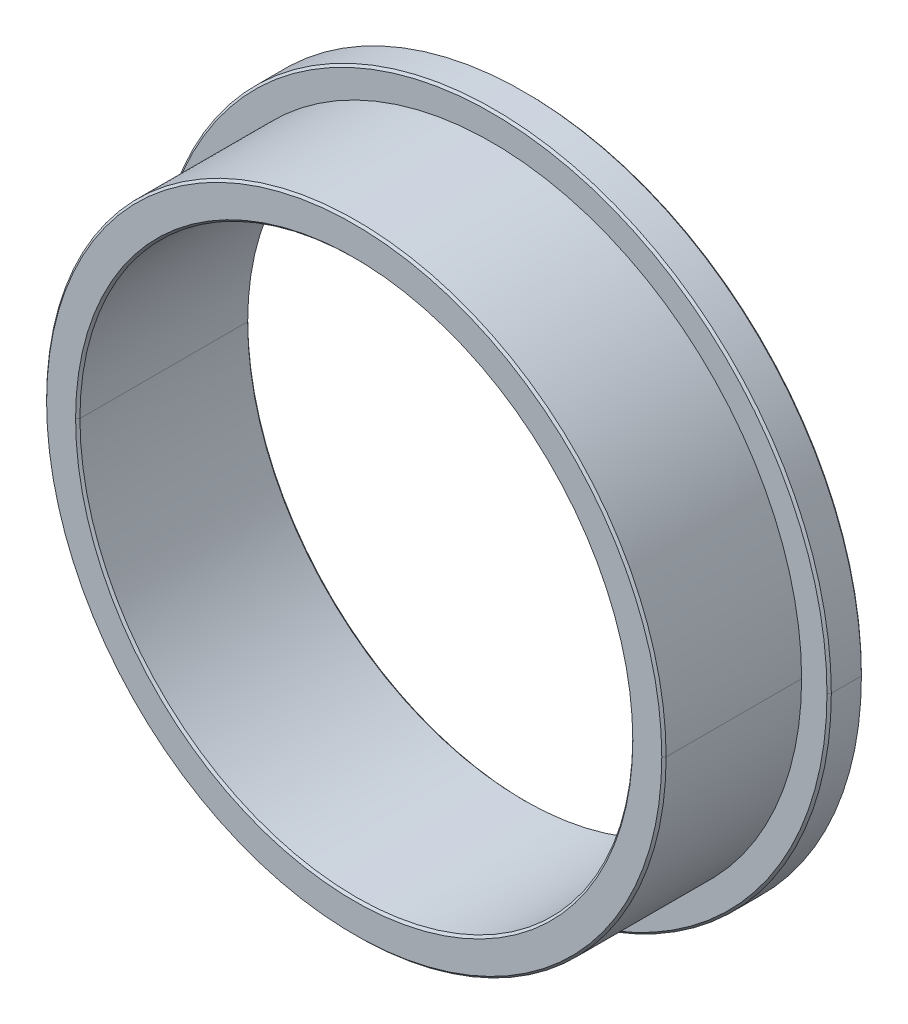
ISO-10303-21;
HEADER;
FILE_DESCRIPTION(('STEP AP214'),'2;1');
FILE_NAME('part.step','',(''),(''),'','','');
FILE_SCHEMA(('AUTOMOTIVE_DESIGN { 1 0 10303 214 1 1 1 1 }'));
ENDSEC;
DATA;
#1=APPLICATION_CONTEXT('core data for automotive mechanical design processes');
#2=APPLICATION_PROTOCOL_DEFINITION('international standard','automotive_design',2000,#1);
#3=PRODUCT_CONTEXT('',#1,'mechanical');
#4=PRODUCT('Part','Part','',(#3));
#5=PRODUCT_RELATED_PRODUCT_CATEGORY('part','',(#4));
#6=PRODUCT_DEFINITION_FORMATION('','',#4);
#7=PRODUCT_DEFINITION_CONTEXT('part definition',#1,'design');
#8=PRODUCT_DEFINITION('design','',#6,#7);
#9=PRODUCT_DEFINITION_SHAPE('','',#8);
#10=(LENGTH_UNIT() NAMED_UNIT(*) SI_UNIT(.MILLI.,.METRE.));
#11=(NAMED_UNIT(*) PLANE_ANGLE_UNIT() SI_UNIT($,.RADIAN.));
#12=(NAMED_UNIT(*) SI_UNIT($,.STERADIAN.) SOLID_ANGLE_UNIT());
#13=UNCERTAINTY_MEASURE_WITH_UNIT(LENGTH_MEASURE(1.E-05),#10,'distance_accuracy_value','');
#14=(GEOMETRIC_REPRESENTATION_CONTEXT(3) GLOBAL_UNCERTAINTY_ASSIGNED_CONTEXT((#13)) GLOBAL_UNIT_ASSIGNED_CONTEXT((#10,
#11,#12)) REPRESENTATION_CONTEXT('',''));
#15=CARTESIAN_POINT('',(0.,0.,0.));
#16=DIRECTION('',(0.,0.,1.));
#17=DIRECTION('',(1.,0.,0.));
#18=AXIS2_PLACEMENT_3D('',#15,#16,#17);
#19=CARTESIAN_POINT('',(0.,0.,6.35));
#20=DIRECTION('',(0.,0.,-1.));
#21=DIRECTION('',(-1.,0.,0.));
#22=AXIS2_PLACEMENT_3D('',#19,#20,#21);
#23=CONICAL_SURFACE('',#22,14.1875,0.785398163397448);
#24=DIRECTION('',(0.707106781186548,0.,-0.707106781186548));
#25=VECTOR('',#24,1.);
#26=CARTESIAN_POINT('',(14.1875,0.,6.35));
#27=LINE('',#26,#25);
#28=CARTESIAN_POINT('',(14.1875,0.,6.35));
#29=VERTEX_POINT('',#28);
#30=CARTESIAN_POINT('',(14.2875,0.,6.25));
#31=VERTEX_POINT('',#30);
#32=EDGE_CURVE('E241',#29,#31,#27,.T.);
#33=ORIENTED_EDGE('',*,*,#32,.F.);
#34=CARTESIAN_POINT('',(0.,0.,6.35));
#35=DIRECTION('',(0.,0.,1.));
#36=DIRECTION('',(1.,0.,0.));
#37=AXIS2_PLACEMENT_3D('',#34,#35,#36);
#38=CIRCLE('',#37,14.1875);
#39=CARTESIAN_POINT('',(-14.1875,0.,6.35));
#40=VERTEX_POINT('',#39);
#41=EDGE_CURVE('E175',#40,#29,#38,.T.);
#42=ORIENTED_EDGE('',*,*,#41,.F.);
#43=DIRECTION('',(-0.707106781186548,0.,-0.707106781186548));
#44=VECTOR('',#43,1.);
#45=CARTESIAN_POINT('',(-14.1875,0.,6.35));
#46=LINE('',#45,#44);
#47=CARTESIAN_POINT('',(-14.2875,0.,6.25));
#48=VERTEX_POINT('',#47);
#49=EDGE_CURVE('E188',#40,#48,#46,.T.);
#50=ORIENTED_EDGE('',*,*,#49,.T.);
#51=CARTESIAN_POINT('',(0.,0.,6.25));
#52=DIRECTION('',(0.,0.,-1.));
#53=DIRECTION('',(1.,0.,0.));
#54=AXIS2_PLACEMENT_3D('',#51,#52,#53);
#55=CIRCLE('',#54,14.2875);
#56=EDGE_CURVE('E9',#31,#48,#55,.T.);
#57=ORIENTED_EDGE('',*,*,#56,.F.);
#58=EDGE_LOOP('',(#33,#42,#50,#57));
#59=FACE_BOUND('',#58,.T.);
#60=ADVANCED_FACE('F14',(#59),#23,.T.);
#61=CARTESIAN_POINT('',(0.,0.,6.25));
#62=DIRECTION('',(0.,0.,1.));
#63=DIRECTION('',(1.,0.,0.));
#64=AXIS2_PLACEMENT_3D('',#61,#62,#63);
#65=CONICAL_SURFACE('',#64,12.7508,0.785398163397466);
#66=DIRECTION('',(-0.70710678118656,0.,0.707106781186535));
#67=VECTOR('',#66,1.);
#68=CARTESIAN_POINT('',(-12.7508,0.,6.25));
#69=LINE('',#68,#67);
#70=CARTESIAN_POINT('',(-12.7508,0.,6.25));
#71=VERTEX_POINT('',#70);
#72=CARTESIAN_POINT('',(-12.8508,0.,6.35));
#73=VERTEX_POINT('',#72);
#74=EDGE_CURVE('E215',#71,#73,#69,.T.);
#75=ORIENTED_EDGE('',*,*,#74,.F.);
#76=CARTESIAN_POINT('',(0.,0.,6.25));
#77=DIRECTION('',(0.,0.,1.));
#78=DIRECTION('',(1.,0.,0.));
#79=AXIS2_PLACEMENT_3D('',#76,#77,#78);
#80=CIRCLE('',#79,12.7508);
#81=CARTESIAN_POINT('',(12.7508,0.,6.25));
#82=VERTEX_POINT('',#81);
#83=EDGE_CURVE('E211',#82,#71,#80,.T.);
#84=ORIENTED_EDGE('',*,*,#83,.F.);
#85=DIRECTION('',(0.70710678118656,0.,0.707106781186535));
#86=VECTOR('',#85,1.);
#87=CARTESIAN_POINT('',(12.7508,0.,6.25));
#88=LINE('',#87,#86);
#89=CARTESIAN_POINT('',(12.8508,0.,6.35));
#90=VERTEX_POINT('',#89);
#91=EDGE_CURVE('E182',#82,#90,#88,.T.);
#92=ORIENTED_EDGE('',*,*,#91,.T.);
#93=CARTESIAN_POINT('',(0.,0.,6.35));
#94=DIRECTION('',(0.,0.,-1.));
#95=DIRECTION('',(1.,0.,0.));
#96=AXIS2_PLACEMENT_3D('',#93,#94,#95);
#97=CIRCLE('',#96,12.8508);
#98=EDGE_CURVE('E25',#73,#90,#97,.T.);
#99=ORIENTED_EDGE('',*,*,#98,.F.);
#100=EDGE_LOOP('',(#75,#84,#92,#99));
#101=FACE_BOUND('',#100,.T.);
#102=ADVANCED_FACE('F303',(#101),#65,.F.);
#103=CARTESIAN_POINT('',(0.,0.,0.));
#104=DIRECTION('',(0.,0.,-1.));
#105=DIRECTION('',(-1.,0.,0.));
#106=AXIS2_PLACEMENT_3D('',#103,#104,#105);
#107=CONICAL_SURFACE('',#106,15.4575,0.785398163397422);
#108=DIRECTION('',(0.707106781186529,0.,-0.707106781186566));
#109=VECTOR('',#108,1.);
#110=CARTESIAN_POINT('',(15.4575,0.,0.));
#111=LINE('',#110,#109);
#112=CARTESIAN_POINT('',(15.4575,0.,0.));
#113=VERTEX_POINT('',#112);
#114=CARTESIAN_POINT('',(15.5575,0.,-0.0999999999999925));
#115=VERTEX_POINT('',#114);
#116=EDGE_CURVE('E198',#113,#115,#111,.T.);
#117=ORIENTED_EDGE('',*,*,#116,.F.);
#118=CARTESIAN_POINT('',(0.,0.,0.));
#119=DIRECTION('',(0.,0.,1.));
#120=DIRECTION('',(1.,0.,0.));
#121=AXIS2_PLACEMENT_3D('',#118,#119,#120);
#122=CIRCLE('',#121,15.4575);
#123=CARTESIAN_POINT('',(-15.4575,0.,0.));
#124=VERTEX_POINT('',#123);
#125=EDGE_CURVE('E86',#124,#113,#122,.T.);
#126=ORIENTED_EDGE('',*,*,#125,.F.);
#127=DIRECTION('',(-0.707106781186529,0.,-0.707106781186566));
#128=VECTOR('',#127,1.);
#129=CARTESIAN_POINT('',(-15.4575,0.,0.));
#130=LINE('',#129,#128);
#131=CARTESIAN_POINT('',(-15.5575,0.,-0.0999999999999925));
#132=VERTEX_POINT('',#131);
#133=EDGE_CURVE('E167',#124,#132,#130,.T.);
#134=ORIENTED_EDGE('',*,*,#133,.T.);
#135=CARTESIAN_POINT('',(0.,0.,-0.0999999999999925));
#136=DIRECTION('',(0.,0.,-1.));
#137=DIRECTION('',(1.,0.,0.));
#138=AXIS2_PLACEMENT_3D('',#135,#136,#137);
#139=CIRCLE('',#138,15.5575);
#140=EDGE_CURVE('E140',#115,#132,#139,.T.);
#141=ORIENTED_EDGE('',*,*,#140,.F.);
#142=EDGE_LOOP('',(#117,#126,#134,#141));
#143=FACE_BOUND('',#142,.T.);
#144=ADVANCED_FACE('F399',(#143),#107,.T.);
#145=CARTESIAN_POINT('',(0.,0.,-1.5875));
#146=DIRECTION('',(0.,0.,-1.));
#147=DIRECTION('',(-1.,0.,0.));
#148=AXIS2_PLACEMENT_3D('',#145,#146,#147);
#149=CONICAL_SURFACE('',#148,12.8508,0.785398163397457);
#150=DIRECTION('',(0.707106781186554,0.,-0.707106781186542));
#151=VECTOR('',#150,1.);
#152=CARTESIAN_POINT('',(12.8508,0.,-1.5875));
#153=LINE('',#152,#151);
#154=CARTESIAN_POINT('',(12.7508,0.,-1.4875));
#155=VERTEX_POINT('',#154);
#156=CARTESIAN_POINT('',(12.8508,0.,-1.5875));
#157=VERTEX_POINT('',#156);
#158=EDGE_CURVE('E207',#155,#157,#153,.T.);
#159=ORIENTED_EDGE('',*,*,#158,.F.);
#160=CARTESIAN_POINT('',(0.,0.,-1.4875));
#161=DIRECTION('',(0.,0.,-1.));
#162=DIRECTION('',(1.,0.,0.));
#163=AXIS2_PLACEMENT_3D('',#160,#161,#162);
#164=CIRCLE('',#163,12.7508);
#165=CARTESIAN_POINT('',(-12.7508,0.,-1.4875));
#166=VERTEX_POINT('',#165);
#167=EDGE_CURVE('E208',#166,#155,#164,.T.);
#168=ORIENTED_EDGE('',*,*,#167,.F.);
#169=DIRECTION('',(-0.707106781186554,0.,-0.707106781186542));
#170=VECTOR('',#169,1.);
#171=CARTESIAN_POINT('',(-12.8508,0.,-1.5875));
#172=LINE('',#171,#170);
#173=CARTESIAN_POINT('',(-12.8508,0.,-1.5875));
#174=VERTEX_POINT('',#173);
#175=EDGE_CURVE('E156',#166,#174,#172,.T.);
#176=ORIENTED_EDGE('',*,*,#175,.T.);
#177=CARTESIAN_POINT('',(0.,0.,-1.5875));
#178=DIRECTION('',(0.,0.,1.));
#179=DIRECTION('',(1.,0.,0.));
#180=AXIS2_PLACEMENT_3D('',#177,#178,#179);
#181=CIRCLE('',#180,12.8508);
#182=EDGE_CURVE('E139',#157,#174,#181,.T.);
#183=ORIENTED_EDGE('',*,*,#182,.F.);
#184=EDGE_LOOP('',(#159,#168,#176,#183));
#185=FACE_BOUND('',#184,.T.);
#186=ADVANCED_FACE('F286',(#185),#149,.F.);
#187=CARTESIAN_POINT('',(0.,0.,-1.4875));
#188=DIRECTION('',(0.,0.,1.));
#189=DIRECTION('',(1.,0.,0.));
#190=AXIS2_PLACEMENT_3D('',#187,#188,#189);
#191=CONICAL_SURFACE('',#190,15.5575,0.785398163397457);
#192=DIRECTION('',(-0.707106781186554,0.,0.707106781186542));
#193=VECTOR('',#192,1.);
#194=CARTESIAN_POINT('',(-15.5575,0.,-1.4875));
#195=LINE('',#194,#193);
#196=CARTESIAN_POINT('',(-15.4575,0.,-1.5875));
#197=VERTEX_POINT('',#196);
#198=CARTESIAN_POINT('',(-15.5575,0.,-1.4875));
#199=VERTEX_POINT('',#198);
#200=EDGE_CURVE('E143',#197,#199,#195,.T.);
#201=ORIENTED_EDGE('',*,*,#200,.F.);
#202=CARTESIAN_POINT('',(0.,0.,-1.5875));
#203=DIRECTION('',(0.,0.,-1.));
#204=DIRECTION('',(1.,0.,0.));
#205=AXIS2_PLACEMENT_3D('',#202,#203,#204);
#206=CIRCLE('',#205,15.4575);
#207=CARTESIAN_POINT('',(15.4575,0.,-1.5875));
#208=VERTEX_POINT('',#207);
#209=EDGE_CURVE('E130',#208,#197,#206,.T.);
#210=ORIENTED_EDGE('',*,*,#209,.F.);
#211=DIRECTION('',(0.707106781186554,0.,0.707106781186542));
#212=VECTOR('',#211,1.);
#213=CARTESIAN_POINT('',(15.5575,0.,-1.4875));
#214=LINE('',#213,#212);
#215=CARTESIAN_POINT('',(15.5575,0.,-1.4875));
#216=VERTEX_POINT('',#215);
#217=EDGE_CURVE('E154',#208,#216,#214,.T.);
#218=ORIENTED_EDGE('',*,*,#217,.T.);
#219=CARTESIAN_POINT('',(0.,0.,-1.4875));
#220=DIRECTION('',(0.,0.,1.));
#221=DIRECTION('',(1.,0.,0.));
#222=AXIS2_PLACEMENT_3D('',#219,#220,#221);
#223=CIRCLE('',#222,15.5575);
#224=EDGE_CURVE('E146',#199,#216,#223,.T.);
#225=ORIENTED_EDGE('',*,*,#224,.F.);
#226=EDGE_LOOP('',(#201,#210,#218,#225));
#227=FACE_BOUND('',#226,.T.);
#228=ADVANCED_FACE('F144',(#227),#191,.T.);
#229=CARTESIAN_POINT('',(0.,0.,6.35));
#230=DIRECTION('',(0.,0.,-1.));
#231=DIRECTION('',(-1.,0.,0.));
#232=AXIS2_PLACEMENT_3D('',#229,#230,#231);
#233=CYLINDRICAL_SURFACE('',#232,14.2875);
#234=DIRECTION('',(0.,0.,-1.));
#235=VECTOR('',#234,1.);
#236=CARTESIAN_POINT('',(14.2875,0.,6.35));
#237=LINE('',#236,#235);
#238=CARTESIAN_POINT('',(14.2875,0.,0.));
#239=VERTEX_POINT('',#238);
#240=EDGE_CURVE('E227',#31,#239,#237,.T.);
#241=ORIENTED_EDGE('',*,*,#240,.F.);
#242=ORIENTED_EDGE('',*,*,#56,.T.);
#243=DIRECTION('',(0.,0.,-1.));
#244=VECTOR('',#243,1.);
#245=CARTESIAN_POINT('',(-14.2875,0.,6.35));
#246=LINE('',#245,#244);
#247=CARTESIAN_POINT('',(-14.2875,0.,0.));
#248=VERTEX_POINT('',#247);
#249=EDGE_CURVE('E181',#48,#248,#246,.T.);
#250=ORIENTED_EDGE('',*,*,#249,.T.);
#251=CARTESIAN_POINT('',(0.,0.,0.));
#252=DIRECTION('',(0.,0.,1.));
#253=DIRECTION('',(1.,0.,0.));
#254=AXIS2_PLACEMENT_3D('',#251,#252,#253);
#255=CIRCLE('',#254,14.2875);
#256=EDGE_CURVE('E39',#248,#239,#255,.T.);
#257=ORIENTED_EDGE('',*,*,#256,.T.);
#258=EDGE_LOOP('',(#241,#242,#250,#257));
#259=FACE_BOUND('',#258,.T.);
#260=ADVANCED_FACE('F308',(#259),#233,.T.);
#261=CARTESIAN_POINT('',(0.,0.,6.35));
#262=DIRECTION('',(0.,0.,1.));
#263=DIRECTION('',(1.,0.,0.));
#264=AXIS2_PLACEMENT_3D('',#261,#262,#263);
#265=PLANE('',#264);
#266=CARTESIAN_POINT('',(0.,0.,6.35));
#267=DIRECTION('',(0.,0.,-1.));
#268=DIRECTION('',(1.,0.,0.));
#269=AXIS2_PLACEMENT_3D('',#266,#267,#268);
#270=CIRCLE('',#269,12.8508);
#271=EDGE_CURVE('E187',#90,#73,#270,.T.);
#272=ORIENTED_EDGE('',*,*,#271,.T.);
#273=ORIENTED_EDGE('',*,*,#98,.T.);
#274=EDGE_LOOP('',(#272,#273));
#275=FACE_BOUND('',#274,.T.);
#276=ORIENTED_EDGE('',*,*,#41,.T.);
#277=CARTESIAN_POINT('',(0.,0.,6.35));
#278=DIRECTION('',(0.,0.,1.));
#279=DIRECTION('',(1.,0.,0.));
#280=AXIS2_PLACEMENT_3D('',#277,#278,#279);
#281=CIRCLE('',#280,14.1875);
#282=EDGE_CURVE('E237',#29,#40,#281,.T.);
#283=ORIENTED_EDGE('',*,*,#282,.T.);
#284=EDGE_LOOP('',(#276,#283));
#285=FACE_BOUND('',#284,.T.);
#286=ADVANCED_FACE('F305',(#275,#285),#265,.T.);
#287=CARTESIAN_POINT('',(0.,0.,-1.5875));
#288=DIRECTION('',(0.,0.,1.));
#289=DIRECTION('',(1.,0.,0.));
#290=AXIS2_PLACEMENT_3D('',#287,#288,#289);
#291=CYLINDRICAL_SURFACE('',#290,12.7508);
#292=DIRECTION('',(0.,0.,1.));
#293=VECTOR('',#292,1.);
#294=CARTESIAN_POINT('',(-12.7508,0.,-1.5875));
#295=LINE('',#294,#293);
#296=EDGE_CURVE('E176',#166,#71,#295,.T.);
#297=ORIENTED_EDGE('',*,*,#296,.F.);
#298=ORIENTED_EDGE('',*,*,#167,.T.);
#299=DIRECTION('',(0.,0.,1.));
#300=VECTOR('',#299,1.);
#301=CARTESIAN_POINT('',(12.7508,0.,-1.5875));
#302=LINE('',#301,#300);
#303=EDGE_CURVE('E180',#155,#82,#302,.T.);
#304=ORIENTED_EDGE('',*,*,#303,.T.);
#305=ORIENTED_EDGE('',*,*,#83,.T.);
#306=EDGE_LOOP('',(#297,#298,#304,#305));
#307=FACE_BOUND('',#306,.T.);
#308=ADVANCED_FACE('F298',(#307),#291,.F.);
#309=CARTESIAN_POINT('',(0.,0.,-1.5875));
#310=DIRECTION('',(0.,0.,1.));
#311=DIRECTION('',(1.,0.,0.));
#312=AXIS2_PLACEMENT_3D('',#309,#310,#311);
#313=PLANE('',#312);
#314=CARTESIAN_POINT('',(0.,0.,-1.5875));
#315=DIRECTION('',(0.,0.,1.));
#316=DIRECTION('',(1.,0.,0.));
#317=AXIS2_PLACEMENT_3D('',#314,#315,#316);
#318=CIRCLE('',#317,12.8508);
#319=EDGE_CURVE('E163',#174,#157,#318,.T.);
#320=ORIENTED_EDGE('',*,*,#319,.T.);
#321=ORIENTED_EDGE('',*,*,#182,.T.);
#322=EDGE_LOOP('',(#320,#321));
#323=FACE_BOUND('',#322,.T.);
#324=ORIENTED_EDGE('',*,*,#209,.T.);
#325=CARTESIAN_POINT('',(0.,0.,-1.5875));
#326=DIRECTION('',(0.,0.,-1.));
#327=DIRECTION('',(1.,0.,0.));
#328=AXIS2_PLACEMENT_3D('',#325,#326,#327);
#329=CIRCLE('',#328,15.4575);
#330=EDGE_CURVE('E134',#197,#208,#329,.T.);
#331=ORIENTED_EDGE('',*,*,#330,.T.);
#332=EDGE_LOOP('',(#324,#331));
#333=FACE_BOUND('',#332,.T.);
#334=ADVANCED_FACE('F132',(#323,#333),#313,.F.);
#335=CARTESIAN_POINT('',(0.,0.,-1.5875));
#336=DIRECTION('',(0.,0.,1.));
#337=DIRECTION('',(1.,0.,0.));
#338=AXIS2_PLACEMENT_3D('',#335,#336,#337);
#339=CYLINDRICAL_SURFACE('',#338,15.5575);
#340=DIRECTION('',(0.,0.,1.));
#341=VECTOR('',#340,1.);
#342=CARTESIAN_POINT('',(-15.5575,0.,-1.5875));
#343=LINE('',#342,#341);
#344=EDGE_CURVE('E234',#199,#132,#343,.T.);
#345=ORIENTED_EDGE('',*,*,#344,.F.);
#346=ORIENTED_EDGE('',*,*,#224,.T.);
#347=DIRECTION('',(0.,0.,1.));
#348=VECTOR('',#347,1.);
#349=CARTESIAN_POINT('',(15.5575,0.,-1.5875));
#350=LINE('',#349,#348);
#351=EDGE_CURVE('E248',#216,#115,#350,.T.);
#352=ORIENTED_EDGE('',*,*,#351,.T.);
#353=ORIENTED_EDGE('',*,*,#140,.T.);
#354=EDGE_LOOP('',(#345,#346,#352,#353));
#355=FACE_BOUND('',#354,.T.);
#356=ADVANCED_FACE('F392',(#355),#339,.T.);
#357=CARTESIAN_POINT('',(0.,0.,0.));
#358=DIRECTION('',(0.,0.,1.));
#359=DIRECTION('',(1.,0.,0.));
#360=AXIS2_PLACEMENT_3D('',#357,#358,#359);
#361=PLANE('',#360);
#362=ORIENTED_EDGE('',*,*,#256,.F.);
#363=CARTESIAN_POINT('',(0.,0.,0.));
#364=DIRECTION('',(0.,0.,1.));
#365=DIRECTION('',(1.,0.,0.));
#366=AXIS2_PLACEMENT_3D('',#363,#364,#365);
#367=CIRCLE('',#366,14.2875);
#368=EDGE_CURVE('E18',#239,#248,#367,.T.);
#369=ORIENTED_EDGE('',*,*,#368,.F.);
#370=EDGE_LOOP('',(#362,#369));
#371=FACE_BOUND('',#370,.T.);
#372=ORIENTED_EDGE('',*,*,#125,.T.);
#373=CARTESIAN_POINT('',(0.,0.,0.));
#374=DIRECTION('',(0.,0.,1.));
#375=DIRECTION('',(1.,0.,0.));
#376=AXIS2_PLACEMENT_3D('',#373,#374,#375);
#377=CIRCLE('',#376,15.4575);
#378=EDGE_CURVE('E186',#113,#124,#377,.T.);
#379=ORIENTED_EDGE('',*,*,#378,.T.);
#380=EDGE_LOOP('',(#372,#379));
#381=FACE_BOUND('',#380,.T.);
#382=ADVANCED_FACE('F554',(#371,#381),#361,.T.);
#383=CARTESIAN_POINT('',(0.,0.,-1.5875));
#384=DIRECTION('',(0.,0.,1.));
#385=DIRECTION('',(1.,0.,0.));
#386=AXIS2_PLACEMENT_3D('',#383,#384,#385);
#387=CYLINDRICAL_SURFACE('',#386,15.5575);
#388=CARTESIAN_POINT('',(0.,0.,-1.4875));
#389=DIRECTION('',(0.,0.,1.));
#390=DIRECTION('',(1.,0.,0.));
#391=AXIS2_PLACEMENT_3D('',#388,#389,#390);
#392=CIRCLE('',#391,15.5575);
#393=EDGE_CURVE('E151',#216,#199,#392,.T.);
#394=ORIENTED_EDGE('',*,*,#393,.T.);
#395=ORIENTED_EDGE('',*,*,#344,.T.);
#396=CARTESIAN_POINT('',(0.,0.,-0.0999999999999925));
#397=DIRECTION('',(0.,0.,-1.));
#398=DIRECTION('',(1.,0.,0.));
#399=AXIS2_PLACEMENT_3D('',#396,#397,#398);
#400=CIRCLE('',#399,15.5575);
#401=EDGE_CURVE('E194',#132,#115,#400,.T.);
#402=ORIENTED_EDGE('',*,*,#401,.T.);
#403=ORIENTED_EDGE('',*,*,#351,.F.);
#404=EDGE_LOOP('',(#394,#395,#402,#403));
#405=FACE_BOUND('',#404,.T.);
#406=ADVANCED_FACE('F394',(#405),#387,.T.);
#407=CARTESIAN_POINT('',(0.,0.,-1.5875));
#408=DIRECTION('',(0.,0.,1.));
#409=DIRECTION('',(1.,0.,0.));
#410=AXIS2_PLACEMENT_3D('',#407,#408,#409);
#411=CYLINDRICAL_SURFACE('',#410,12.7508);
#412=CARTESIAN_POINT('',(0.,0.,-1.4875));
#413=DIRECTION('',(0.,0.,-1.));
#414=DIRECTION('',(1.,0.,0.));
#415=AXIS2_PLACEMENT_3D('',#412,#413,#414);
#416=CIRCLE('',#415,12.7508);
#417=EDGE_CURVE('E224',#155,#166,#416,.T.);
#418=ORIENTED_EDGE('',*,*,#417,.T.);
#419=ORIENTED_EDGE('',*,*,#296,.T.);
#420=CARTESIAN_POINT('',(0.,0.,6.25));
#421=DIRECTION('',(0.,0.,1.));
#422=DIRECTION('',(1.,0.,0.));
#423=AXIS2_PLACEMENT_3D('',#420,#421,#422);
#424=CIRCLE('',#423,12.7508);
#425=EDGE_CURVE('E192',#71,#82,#424,.T.);
#426=ORIENTED_EDGE('',*,*,#425,.T.);
#427=ORIENTED_EDGE('',*,*,#303,.F.);
#428=EDGE_LOOP('',(#418,#419,#426,#427));
#429=FACE_BOUND('',#428,.T.);
#430=ADVANCED_FACE('F293',(#429),#411,.F.);
#431=CARTESIAN_POINT('',(0.,0.,6.35));
#432=DIRECTION('',(0.,0.,-1.));
#433=DIRECTION('',(-1.,0.,0.));
#434=AXIS2_PLACEMENT_3D('',#431,#432,#433);
#435=CYLINDRICAL_SURFACE('',#434,14.2875);
#436=CARTESIAN_POINT('',(0.,0.,6.25));
#437=DIRECTION('',(0.,0.,-1.));
#438=DIRECTION('',(1.,0.,0.));
#439=AXIS2_PLACEMENT_3D('',#436,#437,#438);
#440=CIRCLE('',#439,14.2875);
#441=EDGE_CURVE('E193',#48,#31,#440,.T.);
#442=ORIENTED_EDGE('',*,*,#441,.T.);
#443=ORIENTED_EDGE('',*,*,#240,.T.);
#444=ORIENTED_EDGE('',*,*,#368,.T.);
#445=ORIENTED_EDGE('',*,*,#249,.F.);
#446=EDGE_LOOP('',(#442,#443,#444,#445));
#447=FACE_BOUND('',#446,.T.);
#448=ADVANCED_FACE('F591',(#447),#435,.T.);
#449=CARTESIAN_POINT('',(0.,0.,-1.4875));
#450=DIRECTION('',(0.,0.,1.));
#451=DIRECTION('',(1.,0.,0.));
#452=AXIS2_PLACEMENT_3D('',#449,#450,#451);
#453=CONICAL_SURFACE('',#452,15.5575,0.785398163397457);
#454=ORIENTED_EDGE('',*,*,#330,.F.);
#455=ORIENTED_EDGE('',*,*,#200,.T.);
#456=ORIENTED_EDGE('',*,*,#393,.F.);
#457=ORIENTED_EDGE('',*,*,#217,.F.);
#458=EDGE_LOOP('',(#454,#455,#456,#457));
#459=FACE_BOUND('',#458,.T.);
#460=ADVANCED_FACE('F153',(#459),#453,.T.);
#461=CARTESIAN_POINT('',(0.,0.,-1.5875));
#462=DIRECTION('',(0.,0.,-1.));
#463=DIRECTION('',(-1.,0.,0.));
#464=AXIS2_PLACEMENT_3D('',#461,#462,#463);
#465=CONICAL_SURFACE('',#464,12.8508,0.785398163397457);
#466=ORIENTED_EDGE('',*,*,#417,.F.);
#467=ORIENTED_EDGE('',*,*,#158,.T.);
#468=ORIENTED_EDGE('',*,*,#319,.F.);
#469=ORIENTED_EDGE('',*,*,#175,.F.);
#470=EDGE_LOOP('',(#466,#467,#468,#469));
#471=FACE_BOUND('',#470,.T.);
#472=ADVANCED_FACE('F290',(#471),#465,.F.);
#473=CARTESIAN_POINT('',(0.,0.,0.));
#474=DIRECTION('',(0.,0.,-1.));
#475=DIRECTION('',(-1.,0.,0.));
#476=AXIS2_PLACEMENT_3D('',#473,#474,#475);
#477=CONICAL_SURFACE('',#476,15.4575,0.785398163397422);
#478=ORIENTED_EDGE('',*,*,#378,.F.);
#479=ORIENTED_EDGE('',*,*,#116,.T.);
#480=ORIENTED_EDGE('',*,*,#401,.F.);
#481=ORIENTED_EDGE('',*,*,#133,.F.);
#482=EDGE_LOOP('',(#478,#479,#480,#481));
#483=FACE_BOUND('',#482,.T.);
#484=ADVANCED_FACE('F398',(#483),#477,.T.);
#485=CARTESIAN_POINT('',(0.,0.,6.25));
#486=DIRECTION('',(0.,0.,1.));
#487=DIRECTION('',(1.,0.,0.));
#488=AXIS2_PLACEMENT_3D('',#485,#486,#487);
#489=CONICAL_SURFACE('',#488,12.7508,0.785398163397466);
#490=ORIENTED_EDGE('',*,*,#425,.F.);
#491=ORIENTED_EDGE('',*,*,#74,.T.);
#492=ORIENTED_EDGE('',*,*,#271,.F.);
#493=ORIENTED_EDGE('',*,*,#91,.F.);
#494=EDGE_LOOP('',(#490,#491,#492,#493));
#495=FACE_BOUND('',#494,.T.);
#496=ADVANCED_FACE('F301',(#495),#489,.F.);
#497=CARTESIAN_POINT('',(0.,0.,6.35));
#498=DIRECTION('',(0.,0.,-1.));
#499=DIRECTION('',(-1.,0.,0.));
#500=AXIS2_PLACEMENT_3D('',#497,#498,#499);
#501=CONICAL_SURFACE('',#500,14.1875,0.785398163397448);
#502=ORIENTED_EDGE('',*,*,#282,.F.);
#503=ORIENTED_EDGE('',*,*,#32,.T.);
#504=ORIENTED_EDGE('',*,*,#441,.F.);
#505=ORIENTED_EDGE('',*,*,#49,.F.);
#506=EDGE_LOOP('',(#502,#503,#504,#505));
#507=FACE_BOUND('',#506,.T.);
#508=ADVANCED_FACE('F16',(#507),#501,.T.);
#509=CLOSED_SHELL('',(#60,#102,#144,#186,#228,#260,#286,#308,#334,#356,#382,#406,#430,#448,#460,
#472,#484,#496,#508));
#510=MANIFOLD_SOLID_BREP('B1',#509);
#511=ADVANCED_BREP_SHAPE_REPRESENTATION('',(#18,#510),#14);
#512=SHAPE_DEFINITION_REPRESENTATION(#9,#511);
ENDSEC;
END-ISO-10303-21;
